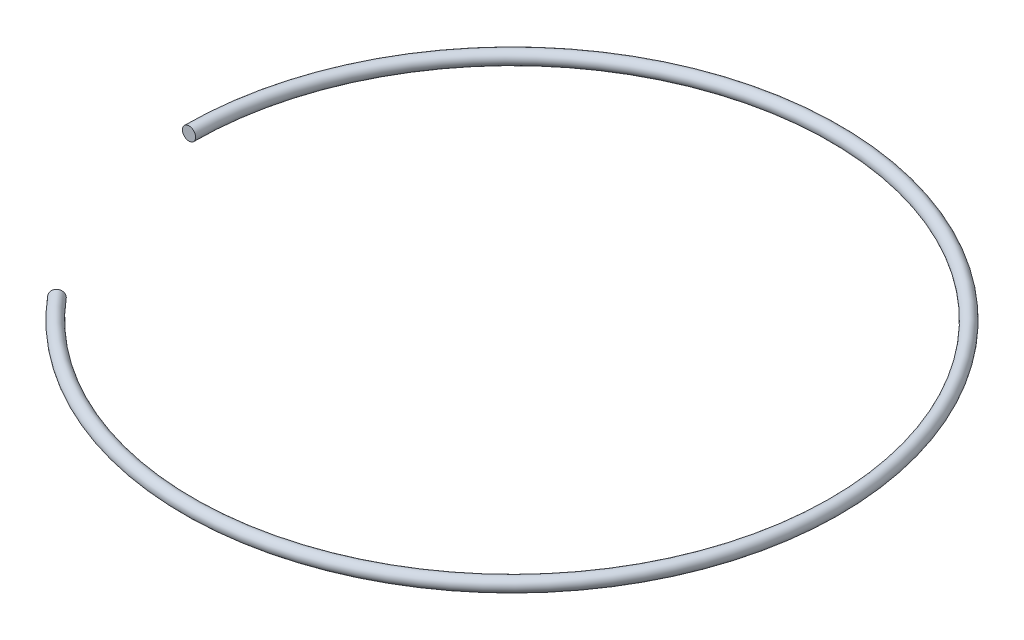
ISO-10303-21;
HEADER;
FILE_DESCRIPTION(('STEP AP214'),'2;1');
FILE_NAME('part.step','',(''),(''),'','','');
FILE_SCHEMA(('AUTOMOTIVE_DESIGN { 1 0 10303 214 1 1 1 1 }'));
ENDSEC;
DATA;
#1=APPLICATION_CONTEXT('core data for automotive mechanical design processes');
#2=APPLICATION_PROTOCOL_DEFINITION('international standard','automotive_design',2000,#1);
#3=PRODUCT_CONTEXT('',#1,'mechanical');
#4=PRODUCT('Part','Part','',(#3));
#5=PRODUCT_RELATED_PRODUCT_CATEGORY('part','',(#4));
#6=PRODUCT_DEFINITION_FORMATION('','',#4);
#7=PRODUCT_DEFINITION_CONTEXT('part definition',#1,'design');
#8=PRODUCT_DEFINITION('design','',#6,#7);
#9=PRODUCT_DEFINITION_SHAPE('','',#8);
#10=(LENGTH_UNIT() NAMED_UNIT(*) SI_UNIT(.MILLI.,.METRE.));
#11=(NAMED_UNIT(*) PLANE_ANGLE_UNIT() SI_UNIT($,.RADIAN.));
#12=(NAMED_UNIT(*) SI_UNIT($,.STERADIAN.) SOLID_ANGLE_UNIT());
#13=UNCERTAINTY_MEASURE_WITH_UNIT(LENGTH_MEASURE(1.E-05),#10,'distance_accuracy_value','');
#14=(GEOMETRIC_REPRESENTATION_CONTEXT(3) GLOBAL_UNCERTAINTY_ASSIGNED_CONTEXT((#13)) GLOBAL_UNIT_ASSIGNED_CONTEXT((#10,
#11,#12)) REPRESENTATION_CONTEXT('',''));
#15=CARTESIAN_POINT('',(0.,0.,0.));
#16=DIRECTION('',(0.,0.,1.));
#17=DIRECTION('',(1.,0.,0.));
#18=AXIS2_PLACEMENT_3D('',#15,#16,#17);
#19=CARTESIAN_POINT('',(-4.749475547338,0.4318,3.985283180056));
#20=DIRECTION('',(0.642787609686505,0.,0.766044443119007));
#21=DIRECTION('',(0.766044443119007,0.,-0.642787609686505));
#22=AXIS2_PLACEMENT_3D('',#19,#20,#21);
#23=PLANE('',#22);
#24=CARTESIAN_POINT('',(-4.84676319161419,0.4318,4.06691720648625));
#25=CARTESIAN_POINT('',(-4.84675629727015,0.41756964292609,4.06691142144471));
#26=CARTESIAN_POINT('',(-4.84489826230594,0.40325171970838,4.06535234499152));
#27=CARTESIAN_POINT('',(-4.83765967703152,0.376272860189243,4.05927845075751));
#28=CARTESIAN_POINT('',(-4.83227912672132,0.363611923887817,4.05476363297669));
#29=CARTESIAN_POINT('',(-4.81861008978791,0.341316101747297,4.04329394912732));
#30=CARTESIAN_POINT('',(-4.81032160316463,0.33168121590828,4.03633908305871));
#31=CARTESIAN_POINT('',(-4.79176901984549,0.316539316925006,4.02077161723824));
#32=CARTESIAN_POINT('',(-4.78150492314962,0.31103230378075,4.01215901748637));
#33=CARTESIAN_POINT('',(-4.76015890693322,0.304763137356641,3.99424758315208));
#34=CARTESIAN_POINT('',(-4.74907698741267,0.304000984076787,3.98494874856965));
#35=CARTESIAN_POINT('',(-4.72734451283432,0.30730744959069,3.9667130371664));
#36=CARTESIAN_POINT('',(-4.71669395777652,0.311376068384446,3.95777616034556));
#37=CARTESIAN_POINT('',(-4.69702525350243,0.323889318093971,3.94127215784344));
#38=CARTESIAN_POINT('',(-4.68800710428614,0.33233394900974,3.93370503216214));
#39=CARTESIAN_POINT('',(-4.67261906632924,0.352631385862718,3.92079293518797));
#40=CARTESIAN_POINT('',(-4.66624917758864,0.364484191799928,3.91544796389509));
#41=CARTESIAN_POINT('',(-4.65687903825141,0.390320794880101,3.90758548343315));
#42=CARTESIAN_POINT('',(-4.65387878765479,0.404304592023065,3.90506797426408));
#43=CARTESIAN_POINT('',(-4.65236537239605,0.422889694465364,3.90379806807866));
#44=CARTESIAN_POINT('',(-4.65218574253996,0.427340547537074,3.90364734073266));
#45=CARTESIAN_POINT('',(-4.65219479740599,0.44603035707391,3.90365493866741));
#46=CARTESIAN_POINT('',(-4.6540528323702,0.460348280291621,3.90521401512059));
#47=CARTESIAN_POINT('',(-4.66129141764462,0.487327139810757,3.9112879093546));
#48=CARTESIAN_POINT('',(-4.66667196795483,0.499988076112183,3.91580272713543));
#49=CARTESIAN_POINT('',(-4.68034100488824,0.522283898252703,3.9272724109848));
#50=CARTESIAN_POINT('',(-4.68862949151151,0.531918784091721,3.93422727705341));
#51=CARTESIAN_POINT('',(-4.70718207483065,0.547060683074994,3.94979474287388));
#52=CARTESIAN_POINT('',(-4.71744617152652,0.55256769621925,3.95840734262575));
#53=CARTESIAN_POINT('',(-4.73879218774293,0.558836862643359,3.97631877696004));
#54=CARTESIAN_POINT('',(-4.74987410726347,0.559599015923213,3.98561761154247));
#55=CARTESIAN_POINT('',(-4.77160658184182,0.55629255040931,4.00385332294572));
#56=CARTESIAN_POINT('',(-4.78225713689962,0.552223931615554,4.01279019976656));
#57=CARTESIAN_POINT('',(-4.80192584117371,0.539710681906029,4.02929420226868));
#58=CARTESIAN_POINT('',(-4.81094399039001,0.53126605099026,4.03686132794998));
#59=CARTESIAN_POINT('',(-4.8263320283469,0.510968614137281,4.04977342492415));
#60=CARTESIAN_POINT('',(-4.8327019170875,0.499115808200072,4.05511839621703));
#61=CARTESIAN_POINT('',(-4.84207205642473,0.473279205119899,4.06298087667897));
#62=CARTESIAN_POINT('',(-4.84507230702136,0.459295407976936,4.06549838584804));
#63=CARTESIAN_POINT('',(-4.84658572228009,0.440710305534636,4.06676829203346));
#64=CARTESIAN_POINT('',(-4.84676535213618,0.436259452462926,4.06691901937946));
#65=CARTESIAN_POINT('',(-4.84676319161419,0.4318,4.06691720648625));
#66=B_SPLINE_CURVE_WITH_KNOTS('',3,(#24,#25,#26,#27,#28,#29,#30,#31,#32,#33,#34,#35,#36,#37,#38,
#39,#40,#41,#42,#43,#44,#45,#46,#47,#48,#49,#50,#51,#52,#53,#54,#55,#56,#57,#58,#59,#60,#61,#62,
#63,#64,#65),.UNSPECIFIED.,.T.,.F.,(4,2,2,2,2,2,2,2,2,2,2,2,2,2,2,2,2,2,2,2,4),(0.,
0.0426429642402328,0.0852859284804657,0.127928892721775,0.170571856963084,0.213214821204393,
0.255857785445701,0.29850074968701,0.341143713928319,0.383786678169627,0.397149959984688,
0.439792924224921,0.482435888465153,0.525078852706463,0.56772181694777,0.61036478118908,
0.653007745430389,0.695650709671698,0.738293673913006,0.780936638154315,0.794299919969375),.UNSPECIFIED.);
#67=CARTESIAN_POINT('',(-4.84676319161419,0.4318,4.06691720648625));
#68=VERTEX_POINT('',#67);
#69=EDGE_CURVE('E19',#68,#68,#66,.T.);
#70=ORIENTED_EDGE('',*,*,#69,.F.);
#71=EDGE_LOOP('',(#70));
#72=FACE_BOUND('',#71,.T.);
#73=ADVANCED_FACE('F15',(#72),#23,.F.);
#74=CARTESIAN_POINT('',(-6.2,0.4318,0.));
#75=DIRECTION('',(0.,0.,1.));
#76=DIRECTION('',(1.,0.,0.));
#77=AXIS2_PLACEMENT_3D('',#74,#75,#76);
#78=PLANE('',#77);
#79=CARTESIAN_POINT('',(-6.327,0.4318,0.));
#80=CARTESIAN_POINT('',(-6.32699100007304,0.44603035707391,0.));
#81=CARTESIAN_POINT('',(-6.32456550768693,0.460348280291621,0.));
#82=CARTESIAN_POINT('',(-6.31511620570525,0.487327139810757,0.));
#83=CARTESIAN_POINT('',(-6.30809239610969,0.499988076112183,0.));
#84=CARTESIAN_POINT('',(-6.29024873565866,0.522283898252703,0.));
#85=CARTESIAN_POINT('',(-6.2794288848031,0.53191878409172,0.));
#86=CARTESIAN_POINT('',(-6.25521020730236,0.547060683074994,0.));
#87=CARTESIAN_POINT('',(-6.24181138065716,0.55256769621925,0.));
#88=CARTESIAN_POINT('',(-6.21394613549006,0.558836862643359,0.));
#89=CARTESIAN_POINT('',(-6.19947971696815,0.559599015923213,0.));
#90=CARTESIAN_POINT('',(-6.17110998623835,0.55629255040931,0.));
#91=CARTESIAN_POINT('',(-6.15720667403046,0.552223931615554,0.));
#92=CARTESIAN_POINT('',(-6.13153100409934,0.539710681906029,0.));
#93=CARTESIAN_POINT('',(-6.1197586463761,0.53126605099026,0.));
#94=CARTESIAN_POINT('',(-6.09967098945865,0.510968614137281,0.));
#95=CARTESIAN_POINT('',(-6.09135569026443,0.499115808200072,0.));
#96=CARTESIAN_POINT('',(-6.07912384207156,0.473279205119899,0.));
#97=CARTESIAN_POINT('',(-6.0752072930729,0.459295407976935,0.));
#98=CARTESIAN_POINT('',(-6.07323166976236,0.440710305534636,0.));
#99=CARTESIAN_POINT('',(-6.07299717963884,0.436259452462926,0.));
#100=CARTESIAN_POINT('',(-6.07300899992696,0.41756964292609,0.));
#101=CARTESIAN_POINT('',(-6.07543449231307,0.40325171970838,0.));
#102=CARTESIAN_POINT('',(-6.08488379429475,0.376272860189243,0.));
#103=CARTESIAN_POINT('',(-6.09190760389031,0.363611923887817,0.));
#104=CARTESIAN_POINT('',(-6.10975126434134,0.341316101747298,0.));
#105=CARTESIAN_POINT('',(-6.1205711151969,0.33168121590828,0.));
#106=CARTESIAN_POINT('',(-6.14478979269765,0.316539316925006,0.));
#107=CARTESIAN_POINT('',(-6.15818861934284,0.31103230378075,0.));
#108=CARTESIAN_POINT('',(-6.18605386450994,0.304763137356641,0.));
#109=CARTESIAN_POINT('',(-6.20052028303185,0.304000984076787,0.));
#110=CARTESIAN_POINT('',(-6.22889001376165,0.30730744959069,0.));
#111=CARTESIAN_POINT('',(-6.24279332596954,0.311376068384446,0.));
#112=CARTESIAN_POINT('',(-6.26846899590066,0.323889318093971,0.));
#113=CARTESIAN_POINT('',(-6.2802413536239,0.33233394900974,0.));
#114=CARTESIAN_POINT('',(-6.30032901054135,0.352631385862718,0.));
#115=CARTESIAN_POINT('',(-6.30864430973557,0.364484191799928,0.));
#116=CARTESIAN_POINT('',(-6.32087615792844,0.390320794880102,0.));
#117=CARTESIAN_POINT('',(-6.3247927069271,0.404304592023065,0.));
#118=CARTESIAN_POINT('',(-6.32676833023764,0.422889694465364,0.));
#119=CARTESIAN_POINT('',(-6.32700282036117,0.427340547537074,0.));
#120=CARTESIAN_POINT('',(-6.327,0.4318,0.));
#121=B_SPLINE_CURVE_WITH_KNOTS('',3,(#79,#80,#81,#82,#83,#84,#85,#86,#87,#88,#89,#90,#91,#92,
#93,#94,#95,#96,#97,#98,#99,#100,#101,#102,#103,#104,#105,#106,#107,#108,#109,#110,#111,#112,
#113,#114,#115,#116,#117,#118,#119,#120),.UNSPECIFIED.,.T.,.F.,(4,2,2,2,2,2,2,2,2,2,2,2,2,2,2,2,
2,2,2,2,4),(0.,0.0426429642402328,0.0852859284804654,0.127928892721774,0.170571856963083,
0.213214821204392,0.255857785445702,0.29850074968701,0.341143713928319,0.383786678169628,
0.397149959984688,0.43979292422492,0.482435888465153,0.525078852706462,0.567721816947772,
0.610364781189079,0.653007745430388,0.695650709671697,0.738293673913007,0.780936638154315,
0.794299919969376),.UNSPECIFIED.);
#122=CARTESIAN_POINT('',(-6.327,0.4318,0.));
#123=VERTEX_POINT('',#122);
#124=EDGE_CURVE('E10',#123,#123,#121,.T.);
#125=ORIENTED_EDGE('',*,*,#124,.F.);
#126=EDGE_LOOP('',(#125));
#127=FACE_BOUND('',#126,.T.);
#128=ADVANCED_FACE('F35',(#127),#78,.T.);
#129=CARTESIAN_POINT('',(0.,0.4318,0.));
#130=DIRECTION('',(0.,-1.,0.));
#131=DIRECTION('',(0.,0.,1.));
#132=AXIS2_PLACEMENT_3D('',#129,#130,#131);
#133=TOROIDAL_SURFACE('',#132,6.2,0.127);
#134=ORIENTED_EDGE('',*,*,#69,.T.);
#135=EDGE_LOOP('',(#134));
#136=FACE_BOUND('',#135,.T.);
#137=ORIENTED_EDGE('',*,*,#124,.T.);
#138=EDGE_LOOP('',(#137));
#139=FACE_BOUND('',#138,.T.);
#140=ADVANCED_FACE('F33',(#136,#139),#133,.T.);
#141=CLOSED_SHELL('',(#73,#128,#140));
#142=MANIFOLD_SOLID_BREP('B1',#141);
#143=ADVANCED_BREP_SHAPE_REPRESENTATION('',(#18,#142),#14);
#144=SHAPE_DEFINITION_REPRESENTATION(#9,#143);
ENDSEC;
END-ISO-10303-21;
